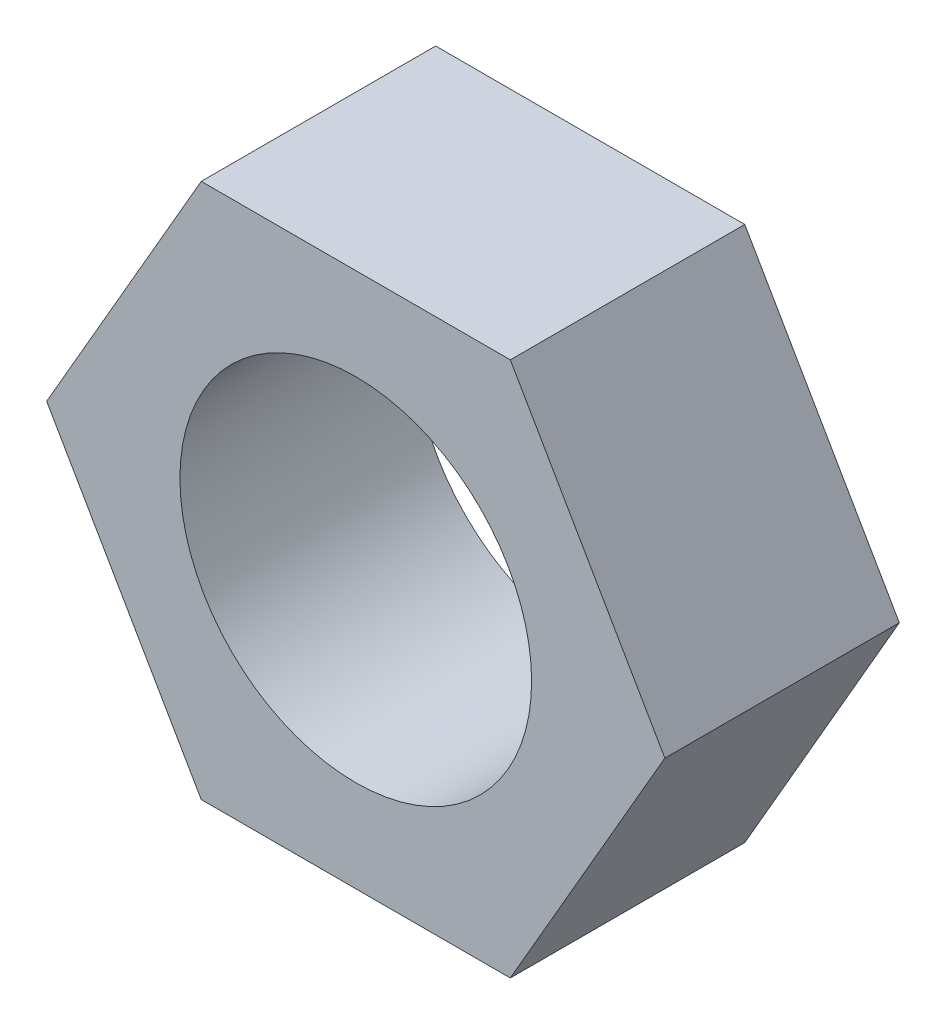
ISO-10303-21;
HEADER;
FILE_DESCRIPTION(('STEP AP214'),'2;1');
FILE_NAME('part.step','',(''),(''),'','','');
FILE_SCHEMA(('AUTOMOTIVE_DESIGN { 1 0 10303 214 1 1 1 1 }'));
ENDSEC;
DATA;
#1=APPLICATION_CONTEXT('core data for automotive mechanical design processes');
#2=APPLICATION_PROTOCOL_DEFINITION('international standard','automotive_design',2000,#1);
#3=PRODUCT_CONTEXT('',#1,'mechanical');
#4=PRODUCT('Part','Part','',(#3));
#5=PRODUCT_RELATED_PRODUCT_CATEGORY('part','',(#4));
#6=PRODUCT_DEFINITION_FORMATION('','',#4);
#7=PRODUCT_DEFINITION_CONTEXT('part definition',#1,'design');
#8=PRODUCT_DEFINITION('design','',#6,#7);
#9=PRODUCT_DEFINITION_SHAPE('','',#8);
#10=(LENGTH_UNIT() NAMED_UNIT(*) SI_UNIT(.MILLI.,.METRE.));
#11=(NAMED_UNIT(*) PLANE_ANGLE_UNIT() SI_UNIT($,.RADIAN.));
#12=(NAMED_UNIT(*) SI_UNIT($,.STERADIAN.) SOLID_ANGLE_UNIT());
#13=UNCERTAINTY_MEASURE_WITH_UNIT(LENGTH_MEASURE(1.E-05),#10,'distance_accuracy_value','');
#14=(GEOMETRIC_REPRESENTATION_CONTEXT(3) GLOBAL_UNCERTAINTY_ASSIGNED_CONTEXT((#13)) GLOBAL_UNIT_ASSIGNED_CONTEXT((#10,
#11,#12)) REPRESENTATION_CONTEXT('',''));
#15=CARTESIAN_POINT('',(0.,0.,0.));
#16=DIRECTION('',(0.,0.,1.));
#17=DIRECTION('',(1.,0.,0.));
#18=AXIS2_PLACEMENT_3D('',#15,#16,#17);
#19=CARTESIAN_POINT('',(1.9774246719745,-3.42499999999996,3.));
#20=DIRECTION('',(-0.866025403784441,0.499999999999995,0.));
#21=DIRECTION('',(-0.499999999999995,-0.866025403784441,0.));
#22=AXIS2_PLACEMENT_3D('',#19,#20,#21);
#23=PLANE('',#22);
#24=DIRECTION('',(0.499999999999995,0.866025403784441,0.));
#25=VECTOR('',#24,1.);
#26=CARTESIAN_POINT('',(1.9774246719745,-3.42499999999996,0.));
#27=LINE('',#26,#25);
#28=CARTESIAN_POINT('',(1.9774246719745,-3.42499999999996,0.));
#29=VERTEX_POINT('',#28);
#30=CARTESIAN_POINT('',(3.95484934394892,0.,0.));
#31=VERTEX_POINT('',#30);
#32=EDGE_CURVE('E123',#29,#31,#27,.T.);
#33=ORIENTED_EDGE('',*,*,#32,.T.);
#34=DIRECTION('',(0.,0.,-1.));
#35=VECTOR('',#34,1.);
#36=CARTESIAN_POINT('',(3.95484934394892,0.,3.));
#37=LINE('',#36,#35);
#38=CARTESIAN_POINT('',(3.95484934394892,0.,3.));
#39=VERTEX_POINT('',#38);
#40=EDGE_CURVE('E11',#39,#31,#37,.T.);
#41=ORIENTED_EDGE('',*,*,#40,.F.);
#42=DIRECTION('',(0.499999999999995,0.866025403784441,0.));
#43=VECTOR('',#42,1.);
#44=CARTESIAN_POINT('',(1.9774246719745,-3.42499999999996,3.));
#45=LINE('',#44,#43);
#46=CARTESIAN_POINT('',(1.9774246719745,-3.42499999999996,3.));
#47=VERTEX_POINT('',#46);
#48=EDGE_CURVE('E134',#47,#39,#45,.T.);
#49=ORIENTED_EDGE('',*,*,#48,.F.);
#50=DIRECTION('',(0.,0.,-1.));
#51=VECTOR('',#50,1.);
#52=CARTESIAN_POINT('',(1.9774246719745,-3.42499999999996,3.));
#53=LINE('',#52,#51);
#54=EDGE_CURVE('E119',#47,#29,#53,.T.);
#55=ORIENTED_EDGE('',*,*,#54,.T.);
#56=EDGE_LOOP('',(#33,#41,#49,#55));
#57=FACE_BOUND('',#56,.T.);
#58=ADVANCED_FACE('F39',(#57),#23,.F.);
#59=CARTESIAN_POINT('',(3.95484934394892,0.,3.));
#60=DIRECTION('',(-0.866025403784438,-0.500000000000001,0.));
#61=DIRECTION('',(0.500000000000001,-0.866025403784438,0.));
#62=AXIS2_PLACEMENT_3D('',#59,#60,#61);
#63=PLANE('',#62);
#64=DIRECTION('',(-0.500000000000001,0.866025403784438,0.));
#65=VECTOR('',#64,1.);
#66=CARTESIAN_POINT('',(3.95484934394892,0.,0.));
#67=LINE('',#66,#65);
#68=CARTESIAN_POINT('',(1.97742467197445,3.42499999999999,0.));
#69=VERTEX_POINT('',#68);
#70=EDGE_CURVE('E126',#31,#69,#67,.T.);
#71=ORIENTED_EDGE('',*,*,#70,.T.);
#72=DIRECTION('',(0.,0.,-1.));
#73=VECTOR('',#72,1.);
#74=CARTESIAN_POINT('',(1.97742467197445,3.42499999999999,3.));
#75=LINE('',#74,#73);
#76=CARTESIAN_POINT('',(1.97742467197445,3.42499999999999,3.));
#77=VERTEX_POINT('',#76);
#78=EDGE_CURVE('E47',#77,#69,#75,.T.);
#79=ORIENTED_EDGE('',*,*,#78,.F.);
#80=DIRECTION('',(-0.500000000000001,0.866025403784438,0.));
#81=VECTOR('',#80,1.);
#82=CARTESIAN_POINT('',(3.95484934394892,0.,3.));
#83=LINE('',#82,#81);
#84=EDGE_CURVE('E92',#39,#77,#83,.T.);
#85=ORIENTED_EDGE('',*,*,#84,.F.);
#86=ORIENTED_EDGE('',*,*,#40,.T.);
#87=EDGE_LOOP('',(#71,#79,#85,#86));
#88=FACE_BOUND('',#87,.T.);
#89=ADVANCED_FACE('F159',(#88),#63,.F.);
#90=CARTESIAN_POINT('',(1.97742467197445,3.42499999999999,3.));
#91=DIRECTION('',(0.,-1.,0.));
#92=DIRECTION('',(1.,0.,0.));
#93=AXIS2_PLACEMENT_3D('',#90,#91,#92);
#94=PLANE('',#93);
#95=DIRECTION('',(-1.,0.,0.));
#96=VECTOR('',#95,1.);
#97=CARTESIAN_POINT('',(1.97742467197445,3.42499999999999,0.));
#98=LINE('',#97,#96);
#99=CARTESIAN_POINT('',(-1.97742467197447,3.42499999999997,0.));
#100=VERTEX_POINT('',#99);
#101=EDGE_CURVE('E129',#69,#100,#98,.T.);
#102=ORIENTED_EDGE('',*,*,#101,.T.);
#103=DIRECTION('',(0.,0.,-1.));
#104=VECTOR('',#103,1.);
#105=CARTESIAN_POINT('',(-1.97742467197447,3.42499999999997,3.));
#106=LINE('',#105,#104);
#107=CARTESIAN_POINT('',(-1.97742467197447,3.42499999999997,3.));
#108=VERTEX_POINT('',#107);
#109=EDGE_CURVE('E114',#108,#100,#106,.T.);
#110=ORIENTED_EDGE('',*,*,#109,.F.);
#111=DIRECTION('',(-1.,0.,0.));
#112=VECTOR('',#111,1.);
#113=CARTESIAN_POINT('',(1.97742467197445,3.42499999999999,3.));
#114=LINE('',#113,#112);
#115=EDGE_CURVE('E105',#77,#108,#114,.T.);
#116=ORIENTED_EDGE('',*,*,#115,.F.);
#117=ORIENTED_EDGE('',*,*,#78,.T.);
#118=EDGE_LOOP('',(#102,#110,#116,#117));
#119=FACE_BOUND('',#118,.T.);
#120=ADVANCED_FACE('F140',(#119),#94,.F.);
#121=CARTESIAN_POINT('',(-1.97742467197447,3.42499999999997,3.));
#122=DIRECTION('',(0.866025403784441,-0.499999999999995,0.));
#123=DIRECTION('',(0.499999999999995,0.866025403784442,0.));
#124=AXIS2_PLACEMENT_3D('',#121,#122,#123);
#125=PLANE('',#124);
#126=DIRECTION('',(-0.499999999999995,-0.866025403784442,0.));
#127=VECTOR('',#126,1.);
#128=CARTESIAN_POINT('',(-1.97742467197447,3.42499999999997,0.));
#129=LINE('',#128,#127);
#130=CARTESIAN_POINT('',(-3.95484934394892,0.,0.));
#131=VERTEX_POINT('',#130);
#132=EDGE_CURVE('E113',#100,#131,#129,.T.);
#133=ORIENTED_EDGE('',*,*,#132,.T.);
#134=DIRECTION('',(0.,0.,-1.));
#135=VECTOR('',#134,1.);
#136=CARTESIAN_POINT('',(-3.95484934394892,0.,3.));
#137=LINE('',#136,#135);
#138=CARTESIAN_POINT('',(-3.95484934394892,0.,3.));
#139=VERTEX_POINT('',#138);
#140=EDGE_CURVE('E110',#139,#131,#137,.T.);
#141=ORIENTED_EDGE('',*,*,#140,.F.);
#142=DIRECTION('',(-0.499999999999995,-0.866025403784442,0.));
#143=VECTOR('',#142,1.);
#144=CARTESIAN_POINT('',(-1.97742467197447,3.42499999999997,3.));
#145=LINE('',#144,#143);
#146=EDGE_CURVE('E99',#108,#139,#145,.T.);
#147=ORIENTED_EDGE('',*,*,#146,.F.);
#148=ORIENTED_EDGE('',*,*,#109,.T.);
#149=EDGE_LOOP('',(#133,#141,#147,#148));
#150=FACE_BOUND('',#149,.T.);
#151=ADVANCED_FACE('F111',(#150),#125,.F.);
#152=CARTESIAN_POINT('',(-3.95484934394892,0.,3.));
#153=DIRECTION('',(0.866025403784435,0.500000000000007,0.));
#154=DIRECTION('',(-0.500000000000007,0.866025403784434,0.));
#155=AXIS2_PLACEMENT_3D('',#152,#153,#154);
#156=PLANE('',#155);
#157=DIRECTION('',(0.500000000000007,-0.866025403784435,0.));
#158=VECTOR('',#157,1.);
#159=CARTESIAN_POINT('',(-3.95484934394892,0.,0.));
#160=LINE('',#159,#158);
#161=CARTESIAN_POINT('',(-1.97742467197443,-3.425,0.));
#162=VERTEX_POINT('',#161);
#163=EDGE_CURVE('E78',#131,#162,#160,.T.);
#164=ORIENTED_EDGE('',*,*,#163,.T.);
#165=DIRECTION('',(0.,0.,-1.));
#166=VECTOR('',#165,1.);
#167=CARTESIAN_POINT('',(-1.97742467197443,-3.425,3.));
#168=LINE('',#167,#166);
#169=CARTESIAN_POINT('',(-1.97742467197443,-3.425,3.));
#170=VERTEX_POINT('',#169);
#171=EDGE_CURVE('E115',#170,#162,#168,.T.);
#172=ORIENTED_EDGE('',*,*,#171,.F.);
#173=DIRECTION('',(0.500000000000007,-0.866025403784435,0.));
#174=VECTOR('',#173,1.);
#175=CARTESIAN_POINT('',(-3.95484934394892,0.,3.));
#176=LINE('',#175,#174);
#177=EDGE_CURVE('E103',#139,#170,#176,.T.);
#178=ORIENTED_EDGE('',*,*,#177,.F.);
#179=ORIENTED_EDGE('',*,*,#140,.T.);
#180=EDGE_LOOP('',(#164,#172,#178,#179));
#181=FACE_BOUND('',#180,.T.);
#182=ADVANCED_FACE('F117',(#181),#156,.F.);
#183=CARTESIAN_POINT('',(-1.97742467197443,-3.425,3.));
#184=DIRECTION('',(0.,1.,0.));
#185=DIRECTION('',(-1.,0.,0.));
#186=AXIS2_PLACEMENT_3D('',#183,#184,#185);
#187=PLANE('',#186);
#188=DIRECTION('',(1.,0.,0.));
#189=VECTOR('',#188,1.);
#190=CARTESIAN_POINT('',(-1.97742467197443,-3.425,0.));
#191=LINE('',#190,#189);
#192=EDGE_CURVE('E84',#162,#29,#191,.T.);
#193=ORIENTED_EDGE('',*,*,#192,.T.);
#194=ORIENTED_EDGE('',*,*,#54,.F.);
#195=DIRECTION('',(1.,0.,0.));
#196=VECTOR('',#195,1.);
#197=CARTESIAN_POINT('',(-1.97742467197443,-3.425,3.));
#198=LINE('',#197,#196);
#199=EDGE_CURVE('E55',#170,#47,#198,.T.);
#200=ORIENTED_EDGE('',*,*,#199,.F.);
#201=ORIENTED_EDGE('',*,*,#171,.T.);
#202=EDGE_LOOP('',(#193,#194,#200,#201));
#203=FACE_BOUND('',#202,.T.);
#204=ADVANCED_FACE('F147',(#203),#187,.F.);
#205=CARTESIAN_POINT('',(0.,0.,3.));
#206=DIRECTION('',(0.,0.,1.));
#207=DIRECTION('',(1.,0.,0.));
#208=AXIS2_PLACEMENT_3D('',#205,#206,#207);
#209=PLANE('',#208);
#210=CARTESIAN_POINT('',(0.,0.,3.));
#211=DIRECTION('',(0.,0.,1.));
#212=DIRECTION('',(1.,0.,0.));
#213=AXIS2_PLACEMENT_3D('',#210,#211,#212);
#214=CIRCLE('',#213,2.25);
#215=CARTESIAN_POINT('',(2.25,0.,3.));
#216=VERTEX_POINT('',#215);
#217=EDGE_CURVE('E213',#216,#216,#214,.T.);
#218=ORIENTED_EDGE('',*,*,#217,.F.);
#219=EDGE_LOOP('',(#218));
#220=FACE_BOUND('',#219,.T.);
#221=ORIENTED_EDGE('',*,*,#48,.T.);
#222=ORIENTED_EDGE('',*,*,#84,.T.);
#223=ORIENTED_EDGE('',*,*,#115,.T.);
#224=ORIENTED_EDGE('',*,*,#146,.T.);
#225=ORIENTED_EDGE('',*,*,#177,.T.);
#226=ORIENTED_EDGE('',*,*,#199,.T.);
#227=EDGE_LOOP('',(#221,#222,#223,#224,#225,#226));
#228=FACE_BOUND('',#227,.T.);
#229=ADVANCED_FACE('F101',(#220,#228),#209,.T.);
#230=CARTESIAN_POINT('',(0.,0.,0.));
#231=DIRECTION('',(0.,0.,1.));
#232=DIRECTION('',(1.,0.,0.));
#233=AXIS2_PLACEMENT_3D('',#230,#231,#232);
#234=PLANE('',#233);
#235=CARTESIAN_POINT('',(0.,0.,0.));
#236=DIRECTION('',(0.,0.,1.));
#237=DIRECTION('',(1.,0.,0.));
#238=AXIS2_PLACEMENT_3D('',#235,#236,#237);
#239=CIRCLE('',#238,2.25);
#240=CARTESIAN_POINT('',(2.25,0.,0.));
#241=VERTEX_POINT('',#240);
#242=EDGE_CURVE('E127',#241,#241,#239,.T.);
#243=ORIENTED_EDGE('',*,*,#242,.T.);
#244=EDGE_LOOP('',(#243));
#245=FACE_BOUND('',#244,.T.);
#246=ORIENTED_EDGE('',*,*,#32,.F.);
#247=ORIENTED_EDGE('',*,*,#192,.F.);
#248=ORIENTED_EDGE('',*,*,#163,.F.);
#249=ORIENTED_EDGE('',*,*,#132,.F.);
#250=ORIENTED_EDGE('',*,*,#101,.F.);
#251=ORIENTED_EDGE('',*,*,#70,.F.);
#252=EDGE_LOOP('',(#246,#247,#248,#249,#250,#251));
#253=FACE_BOUND('',#252,.T.);
#254=ADVANCED_FACE('F143',(#245,#253),#234,.F.);
#255=CARTESIAN_POINT('',(0.,0.,3.));
#256=DIRECTION('',(0.,0.,1.));
#257=DIRECTION('',(1.,0.,0.));
#258=AXIS2_PLACEMENT_3D('',#255,#256,#257);
#259=CYLINDRICAL_SURFACE('',#258,2.25);
#260=ORIENTED_EDGE('',*,*,#217,.T.);
#261=EDGE_LOOP('',(#260));
#262=FACE_BOUND('',#261,.T.);
#263=ORIENTED_EDGE('',*,*,#242,.F.);
#264=EDGE_LOOP('',(#263));
#265=FACE_BOUND('',#264,.T.);
#266=ADVANCED_FACE('F198',(#262,#265),#259,.F.);
#267=CLOSED_SHELL('',(#58,#89,#120,#151,#182,#204,#229,#254,#266));
#268=MANIFOLD_SOLID_BREP('B2',#267);
#269=ADVANCED_BREP_SHAPE_REPRESENTATION('',(#18,#268),#14);
#270=SHAPE_DEFINITION_REPRESENTATION(#9,#269);
ENDSEC;
END-ISO-10303-21;
